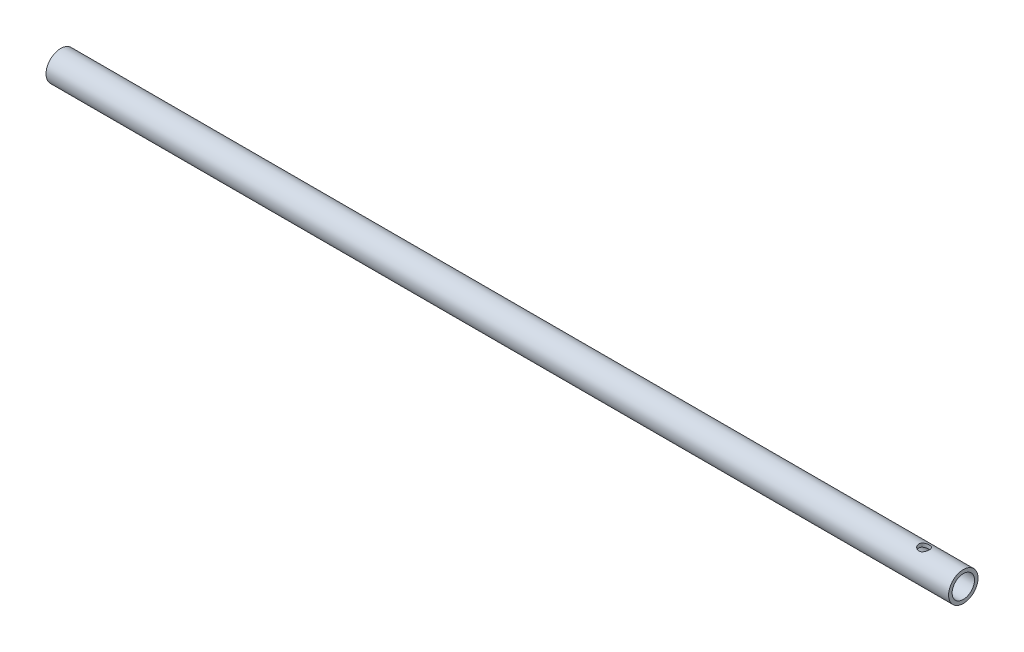
ISO-10303-21;
HEADER;
FILE_DESCRIPTION(('STEP AP214'),'2;1');
FILE_NAME('part.step','',(''),(''),'','','');
FILE_SCHEMA(('AUTOMOTIVE_DESIGN { 1 0 10303 214 1 1 1 1 }'));
ENDSEC;
DATA;
#1=APPLICATION_CONTEXT('core data for automotive mechanical design processes');
#2=APPLICATION_PROTOCOL_DEFINITION('international standard','automotive_design',2000,#1);
#3=PRODUCT_CONTEXT('',#1,'mechanical');
#4=PRODUCT('Part','Part','',(#3));
#5=PRODUCT_RELATED_PRODUCT_CATEGORY('part','',(#4));
#6=PRODUCT_DEFINITION_FORMATION('','',#4);
#7=PRODUCT_DEFINITION_CONTEXT('part definition',#1,'design');
#8=PRODUCT_DEFINITION('design','',#6,#7);
#9=PRODUCT_DEFINITION_SHAPE('','',#8);
#10=(LENGTH_UNIT() NAMED_UNIT(*) SI_UNIT(.MILLI.,.METRE.));
#11=(NAMED_UNIT(*) PLANE_ANGLE_UNIT() SI_UNIT($,.RADIAN.));
#12=(NAMED_UNIT(*) SI_UNIT($,.STERADIAN.) SOLID_ANGLE_UNIT());
#13=UNCERTAINTY_MEASURE_WITH_UNIT(LENGTH_MEASURE(1.E-05),#10,'distance_accuracy_value','');
#14=(GEOMETRIC_REPRESENTATION_CONTEXT(3) GLOBAL_UNCERTAINTY_ASSIGNED_CONTEXT((#13)) GLOBAL_UNIT_ASSIGNED_CONTEXT((#10,
#11,#12)) REPRESENTATION_CONTEXT('',''));
#15=CARTESIAN_POINT('',(0.,0.,0.));
#16=DIRECTION('',(0.,0.,1.));
#17=DIRECTION('',(1.,0.,0.));
#18=AXIS2_PLACEMENT_3D('',#15,#16,#17);
#19=CARTESIAN_POINT('',(0.,38.1,2032.));
#20=DIRECTION('',(0.,1.,0.));
#21=DIRECTION('',(0.,0.,1.));
#22=AXIS2_PLACEMENT_3D('',#19,#20,#21);
#23=CYLINDRICAL_SURFACE('',#22,3.3782);
#24=CARTESIAN_POINT('',(0.,-8.90580651934448,2028.6218));
#25=CARTESIAN_POINT('',(-0.0915206203541388,-8.90580687415743,2028.62180056569));
#26=CARTESIAN_POINT('',(-0.183043122337678,-8.90722275279153,2028.62552481863));
#27=CARTESIAN_POINT('',(-0.365410398842224,-8.91283224955234,2028.6403724418));
#28=CARTESIAN_POINT('',(-0.456254902432182,-8.9170269236798,2028.65149862492));
#29=CARTESIAN_POINT('',(-0.7269690249561,-8.93362066725651,2028.69589150111));
#30=CARTESIAN_POINT('',(-0.904923341874351,-8.95002926216944,2028.74017239345));
#31=CARTESIAN_POINT('',(-1.24982728710451,-8.9914453113372,2028.85623560384));
#32=CARTESIAN_POINT('',(-1.41680634047034,-9.01642855398771,2028.92794055109));
#33=CARTESIAN_POINT('',(-1.73640001041975,-9.07213881171126,2029.09659037364));
#34=CARTESIAN_POINT('',(-1.88901531039768,-9.10286555331392,2029.1935340473));
#35=CARTESIAN_POINT('',(-2.18236541050709,-9.16814057028092,2029.41454111232));
#36=CARTESIAN_POINT('',(-2.32236987087505,-9.20279315504331,2029.53954292769));
#37=CARTESIAN_POINT('',(-2.57994201764627,-9.27114039689816,2029.8111260333));
#38=CARTESIAN_POINT('',(-2.6975044755519,-9.30483482920966,2029.9577123382));
#39=CARTESIAN_POINT('',(-2.91024472717621,-9.36868652345153,2030.27371758884));
#40=CARTESIAN_POINT('',(-3.00464634523043,-9.39870756628294,2030.44368902768));
#41=CARTESIAN_POINT('',(-3.1632212659766,-9.45059348004089,2030.79834974884));
#42=CARTESIAN_POINT('',(-3.22740395037381,-9.47246088189008,2030.98303444248));
#43=CARTESIAN_POINT('',(-3.32120959838803,-9.50483860349147,2031.35423903006));
#44=CARTESIAN_POINT('',(-3.35208228499956,-9.51575843098211,2031.54040671183));
#45=CARTESIAN_POINT('',(-3.38238054486771,-9.52647223289394,2031.9155791645));
#46=CARTESIAN_POINT('',(-3.3818152794428,-9.52626944855033,2032.10458309283));
#47=CARTESIAN_POINT('',(-3.35001411582869,-9.51502996935777,2032.47116121979));
#48=CARTESIAN_POINT('',(-3.32013892684087,-9.50447392939019,2032.64887068279));
#49=CARTESIAN_POINT('',(-3.23283542772789,-9.47433087848601,2032.99656788178));
#50=CARTESIAN_POINT('',(-3.17540510229639,-9.45474320700498,2033.16655505198));
#51=CARTESIAN_POINT('',(-3.03390759166911,-9.40816014289965,2033.49678557571));
#52=CARTESIAN_POINT('',(-2.94947967772757,-9.38106513649884,2033.65685973749));
#53=CARTESIAN_POINT('',(-2.75669845642623,-9.32225082488363,2033.96093960376));
#54=CARTESIAN_POINT('',(-2.64833906236345,-9.29053034393033,2034.10494120632));
#55=CARTESIAN_POINT('',(-2.40406577776571,-9.22379709718782,2034.38084012778));
#56=CARTESIAN_POINT('',(-2.26700070143769,-9.18869892499172,2034.51169960101));
#57=CARTESIAN_POINT('',(-1.97260200788268,-9.1205279895685,2034.74897619883));
#58=CARTESIAN_POINT('',(-1.81525791627633,-9.08745628615564,2034.85538061244));
#59=CARTESIAN_POINT('',(-1.48083520985759,-9.02656550509255,2035.04247664914));
#60=CARTESIAN_POINT('',(-1.30344278177014,-8.99885612239196,2035.12265066455));
#61=CARTESIAN_POINT('',(-1.02855582444714,-8.96454083977648,2035.21928108565));
#62=CARTESIAN_POINT('',(-0.9355039395898,-8.95431349377785,2035.24754544209));
#63=CARTESIAN_POINT('',(-0.747076735131655,-8.93659583875025,2035.29599054773));
#64=CARTESIAN_POINT('',(-0.651702497300307,-8.92910428043567,2035.31617498699));
#65=CARTESIAN_POINT('',(-0.46384609018976,-8.91740766471935,2035.34749608823));
#66=CARTESIAN_POINT('',(-0.371434631959882,-8.9130664316492,2035.35900858763));
#67=CARTESIAN_POINT('',(-0.185883516350636,-8.90726360341033,2035.37436630476));
#68=CARTESIAN_POINT('',(-0.0927438566899769,-8.90580201726654,2035.37821149845));
#69=CARTESIAN_POINT('',(0.0919195633287035,-8.90581096074277,2035.37818865508));
#70=CARTESIAN_POINT('',(0.183443277058186,-8.90723097740055,2035.37445349743));
#71=CARTESIAN_POINT('',(0.365811939414904,-8.91284871699308,2035.35958390067));
#72=CARTESIAN_POINT('',(0.456656617127483,-8.91704749438991,2035.34844665266));
#73=CARTESIAN_POINT('',(0.727369374583149,-8.93365328239551,2035.30402053424));
#74=CARTESIAN_POINT('',(0.905320609788449,-8.95006954930708,2035.25971742784));
#75=CARTESIAN_POINT('',(1.25021472412577,-8.9914992832786,2035.14361047525));
#76=CARTESIAN_POINT('',(1.41718703500265,-9.01648854644952,2035.07188398812));
#77=CARTESIAN_POINT('',(1.73676398420038,-9.07220864499143,2034.90319207242));
#78=CARTESIAN_POINT('',(1.88936929905393,-9.10293920980459,2034.80622783309));
#79=CARTESIAN_POINT('',(2.18269668330051,-9.16821962469528,2034.58517950727));
#80=CARTESIAN_POINT('',(2.32268818598684,-9.20287369422962,2034.46015692));
#81=CARTESIAN_POINT('',(2.58023088482001,-9.27122099114283,2034.18853381479));
#82=CARTESIAN_POINT('',(2.69777685725995,-9.3049139933061,2034.04192828792));
#83=CARTESIAN_POINT('',(2.91047725722951,-9.36875899356517,2033.72589034489));
#84=CARTESIAN_POINT('',(3.00485609331308,-9.3987748054751,2033.55590599534));
#85=CARTESIAN_POINT('',(3.16338337472917,-9.45064792310465,2033.201223462));
#86=CARTESIAN_POINT('',(3.22754120703232,-9.47250776171856,2033.01652986793));
#87=CARTESIAN_POINT('',(3.32129585259917,-9.5048688530745,2032.64531613536));
#88=CARTESIAN_POINT('',(3.35214304577981,-9.51577986936375,2032.45914819732));
#89=CARTESIAN_POINT('',(3.3823912915841,-9.52647608392381,2032.08397999424));
#90=CARTESIAN_POINT('',(3.38180150062316,-9.52626452178515,2031.89498056994));
#91=CARTESIAN_POINT('',(3.34995407972146,-9.51500879982829,2031.52841273738));
#92=CARTESIAN_POINT('',(3.32005663063988,-9.50444509403896,2031.35070892042));
#93=CARTESIAN_POINT('',(3.23271027326889,-9.47428808657123,2031.0030265612));
#94=CARTESIAN_POINT('',(3.1752593464374,-9.4546941233487,2030.83304858593));
#95=CARTESIAN_POINT('',(3.03372071539422,-9.40809973286049,2030.50283541726));
#96=CARTESIAN_POINT('',(2.9492716670067,-9.38099954054635,2030.34276975871));
#97=CARTESIAN_POINT('',(2.75644941863552,-9.32217698537447,2030.03871012042));
#98=CARTESIAN_POINT('',(2.64807013295788,-9.29045344745351,2029.89472024295));
#99=CARTESIAN_POINT('',(2.40375733435914,-9.22371644143164,2029.61884820241));
#100=CARTESIAN_POINT('',(2.26667267614132,-9.18861769960238,2029.48800408219));
#101=CARTESIAN_POINT('',(1.97223673908679,-9.1204486913023,2029.25076146443));
#102=CARTESIAN_POINT('',(1.81487498040229,-9.08737948689992,2029.14437568744));
#103=CARTESIAN_POINT('',(1.48042363384821,-9.0264977494164,2028.95732310065));
#104=CARTESIAN_POINT('',(1.30302072678317,-8.99879481595814,2028.87717322962));
#105=CARTESIAN_POINT('',(1.02812157245388,-8.96449097859576,2028.78058021477));
#106=CARTESIAN_POINT('',(0.935066314856111,-8.95426774782618,2028.75232853722));
#107=CARTESIAN_POINT('',(0.746633565856914,-8.93655877043514,2028.70390905203));
#108=CARTESIAN_POINT('',(0.651257157136259,-8.92907177266856,2028.6837375493));
#109=CARTESIAN_POINT('',(0.463536581531303,-8.91739297008603,2028.6524649567));
#110=CARTESIAN_POINT('',(0.371265206685649,-8.91306084078929,2028.6409766089));
#111=CARTESIAN_POINT('',(0.185996537149762,-8.90726743034958,2028.62564383037));
#112=CARTESIAN_POINT('',(0.0929992400350158,-8.90580615879911,2028.62179942517));
#113=CARTESIAN_POINT('',(0.,-8.90580651934448,2028.6218));
#114=B_SPLINE_CURVE_WITH_KNOTS('',3,(#24,#25,#26,#27,#28,#29,#30,#31,#32,#33,#34,#35,#36,#37,
#38,#39,#40,#41,#42,#43,#44,#45,#46,#47,#48,#49,#50,#51,#52,#53,#54,#55,#56,#57,#58,#59,#60,#61,
#62,#63,#64,#65,#66,#67,#68,#69,#70,#71,#72,#73,#74,#75,#76,#77,#78,#79,#80,#81,#82,#83,#84,#85,
#86,#87,#88,#89,#90,#91,#92,#93,#94,#95,#96,#97,#98,#99,#100,#101,#102,#103,#104,#105,#106,#107,
#108,#109,#110,#111,#112,#113),.UNSPECIFIED.,.T.,.F.,(4,2,2,2,2,2,2,2,2,2,2,2,2,2,2,2,2,2,2,2,2,
2,2,2,2,2,2,2,2,2,2,2,2,2,2,2,2,2,2,2,2,2,2,2,4),(0.,0.274468364538614,0.549041092711528,
1.0984704637008,1.64636104334585,2.19422554242584,2.76425260796029,3.33441231573246,
3.92165414154812,4.50871353311567,5.07288722742166,5.63689651700481,6.17590383987418,
6.7149505902563,7.26152394699874,7.80823647895222,8.38376107616807,8.95958413978659,
9.54616675367551,9.83919663136975,10.132092530416,10.4114194123222,10.6907471696473,
10.9652207647424,11.2397985746675,11.7892370881635,12.3371369825379,12.8850110637365,
13.4550510885109,14.0252236163912,14.6124636215983,15.1995211032332,15.7636816699461,
16.3276779187254,16.8666810899068,17.4057237539911,17.9523063319348,18.499028071613,
19.0745633426128,19.6503972705725,20.2369758679105,20.5300031069142,20.8228961908011,
21.1017979719347,21.3807006849733),.UNSPECIFIED.);
#115=CARTESIAN_POINT('',(0.,-8.90580651934448,2028.6218));
#116=VERTEX_POINT('',#115);
#117=EDGE_CURVE('E46',#116,#116,#114,.T.);
#118=ORIENTED_EDGE('',*,*,#117,.F.);
#119=EDGE_LOOP('',(#118));
#120=FACE_BOUND('',#119,.T.);
#121=CARTESIAN_POINT('',(0.,-6.40241249530186,2028.6218));
#122=CARTESIAN_POINT('',(-0.0890179996863658,-6.40241148977448,2028.62179931325));
#123=CARTESIAN_POINT('',(-0.178022826666587,-6.40427611916514,2028.62532380031));
#124=CARTESIAN_POINT('',(-0.355333842737386,-6.41165195374766,2028.63936094135));
#125=CARTESIAN_POINT('',(-0.44363984347501,-6.41716411030146,2028.64987541849));
#126=CARTESIAN_POINT('',(-0.706637415629791,-6.43893158835621,2028.69177548396));
#127=CARTESIAN_POINT('',(-0.879371076444259,-6.46041780055707,2028.73351763899));
#128=CARTESIAN_POINT('',(-1.2137262290946,-6.51435002917386,2028.84247391846));
#129=CARTESIAN_POINT('',(-1.37539279241821,-6.54674796142641,2028.9095764443));
#130=CARTESIAN_POINT('',(-1.68521259182856,-6.61876943782388,2029.06699964205));
#131=CARTESIAN_POINT('',(-1.83336335597807,-6.65839429976084,2029.15732454966));
#132=CARTESIAN_POINT('',(-2.12354646252068,-6.74386605637626,2029.36618406807));
#133=CARTESIAN_POINT('',(-2.26439057117016,-6.78995511701508,2029.4862701926));
#134=CARTESIAN_POINT('',(-2.52484147302545,-6.8811928452854,2029.74799823764));
#135=CARTESIAN_POINT('',(-2.64443986726998,-6.92634113480838,2029.88964864215));
#136=CARTESIAN_POINT('',(-2.86564214482997,-7.01369162971585,2030.20035832676));
#137=CARTESIAN_POINT('',(-2.96583496438417,-7.05558003978932,2030.37051854996));
#138=CARTESIAN_POINT('',(-3.13564095599325,-7.12862072998245,2030.72759712823));
#139=CARTESIAN_POINT('',(-3.20527078825541,-7.15977885729212,2030.91450628621));
#140=CARTESIAN_POINT('',(-3.30743411105787,-7.20611334996814,2031.28722350597));
#141=CARTESIAN_POINT('',(-3.34203805441672,-7.22217704717831,2031.47235134226));
#142=CARTESIAN_POINT('',(-3.37993234138131,-7.2397878630478,2031.84643282999));
#143=CARTESIAN_POINT('',(-3.3832388245397,-7.24134246378853,2032.03538445918));
#144=CARTESIAN_POINT('',(-3.35936440273945,-7.23022400805472,2032.39640335801));
#145=CARTESIAN_POINT('',(-3.33448122866513,-7.21862317506157,2032.56866253819));
#146=CARTESIAN_POINT('',(-3.25897283937589,-7.18405642248002,2032.9062287846));
#147=CARTESIAN_POINT('',(-3.20834577871978,-7.16108968813427,2033.07153535151));
#148=CARTESIAN_POINT('',(-3.08230993550248,-7.10551088746438,2033.39354044798));
#149=CARTESIAN_POINT('',(-3.00654250415638,-7.07275995779467,2033.55007364526));
#150=CARTESIAN_POINT('',(-2.83280098790854,-7.00067158770838,2033.84860382737));
#151=CARTESIAN_POINT('',(-2.7348192653187,-6.96133188316627,2033.99059578822));
#152=CARTESIAN_POINT('',(-2.5098062031957,-6.87592107228675,2034.2688707602));
#153=CARTESIAN_POINT('',(-2.38101423927152,-6.82956202865565,2034.40364424353));
#154=CARTESIAN_POINT('',(-2.10285082118896,-6.73762592159223,2034.65045262685));
#155=CARTESIAN_POINT('',(-1.95346281182404,-6.69204952073139,2034.76246905361));
#156=CARTESIAN_POINT('',(-1.6289073843438,-6.6044490757177,2034.96602488187));
#157=CARTESIAN_POINT('',(-1.45282140027363,-6.56271889645303,2035.05625138864));
#158=CARTESIAN_POINT('',(-1.17770068044086,-6.50920402700182,2035.16781820475));
#159=CARTESIAN_POINT('',(-1.08420504225008,-6.4928842847101,2035.20103566176));
#160=CARTESIAN_POINT('',(-0.894151097996211,-6.46386824227027,2035.25923120241));
#161=CARTESIAN_POINT('',(-0.797594173330214,-6.45117033292739,2035.28421294597));
#162=CARTESIAN_POINT('',(-0.585239211869538,-6.42809559885846,2035.3291834789));
#163=CARTESIAN_POINT('',(-0.469008571097502,-6.41850331615469,2035.34755479999));
#164=CARTESIAN_POINT('',(-0.234912027715166,-6.40565541834833,2035.37207590054));
#165=CARTESIAN_POINT('',(-0.117046259859072,-6.40239928415844,2035.37822668115));
#166=CARTESIAN_POINT('',(0.0898184343522924,-6.4024225623206,2035.37817967946));
#167=CARTESIAN_POINT('',(0.178828191060674,-6.40429850269924,2035.37463377207));
#168=CARTESIAN_POINT('',(0.35614683167679,-6.41169702274945,2035.36055313633));
#169=CARTESIAN_POINT('',(0.444455527554662,-6.41722054937558,2035.35001659314));
#170=CARTESIAN_POINT('',(0.707457247499605,-6.43902158156982,2035.30804981486));
#171=CARTESIAN_POINT('',(0.88018903173179,-6.46052941882042,2035.26626250609));
#172=CARTESIAN_POINT('',(1.21453262655581,-6.51450055149511,2035.15721645588));
#173=CARTESIAN_POINT('',(1.37618954441662,-6.54691577917453,2035.09006931638));
#174=CARTESIAN_POINT('',(1.68598357300176,-6.61896616138833,2034.93255774833));
#175=CARTESIAN_POINT('',(1.83411820100346,-6.65860263777402,2034.84218906784));
#176=CARTESIAN_POINT('',(2.12426516423679,-6.74409284386059,2034.63323734758));
#177=CARTESIAN_POINT('',(2.26508836587838,-6.79018835468618,2034.51310228716));
#178=CARTESIAN_POINT('',(2.52548888154606,-6.88143091288963,2034.2512770643));
#179=CARTESIAN_POINT('',(2.64505780495999,-6.92657757951534,2034.10957842992));
#180=CARTESIAN_POINT('',(2.86617869974458,-7.01391156699681,2033.79878709844));
#181=CARTESIAN_POINT('',(2.96632162174662,-7.05578516134445,2033.62859559797));
#182=CARTESIAN_POINT('',(3.13602223871757,-7.12878898318622,2033.27146309677));
#183=CARTESIAN_POINT('',(3.20559662050195,-7.15992507009044,2033.08453130153));
#184=CARTESIAN_POINT('',(3.3076446786845,-7.20621031910312,2032.71179522409));
#185=CARTESIAN_POINT('',(3.34219136773074,-7.22224810591477,2032.52667122944));
#186=CARTESIAN_POINT('',(3.37997491512424,-7.23980785431812,2032.15260888324));
#187=CARTESIAN_POINT('',(3.38322789070649,-7.24133728815683,2031.96367254541));
#188=CARTESIAN_POINT('',(3.35925619256842,-7.23017367237102,2031.60268348654));
#189=CARTESIAN_POINT('',(3.334327348999,-7.21855191266277,2031.4304382436));
#190=CARTESIAN_POINT('',(3.25873204223378,-7.18394700864941,2031.0929071505));
#191=CARTESIAN_POINT('',(3.20806372675145,-7.16096304669069,2030.92762180212));
#192=CARTESIAN_POINT('',(3.08194459384531,-7.10535208141189,2030.6056509294));
#193=CARTESIAN_POINT('',(3.00613310530983,-7.07258547532763,2030.4491317863));
#194=CARTESIAN_POINT('',(2.83230528522054,-7.00047054984572,2030.15063614203));
#195=CARTESIAN_POINT('',(2.7342813120035,-6.9611199666132,2030.00866467009));
#196=CARTESIAN_POINT('',(2.50917981787695,-6.87569171726644,2029.73043553201));
#197=CARTESIAN_POINT('',(2.38034136898433,-6.82932655832314,2029.59568831908));
#198=CARTESIAN_POINT('',(2.10208666264616,-6.73738653128031,2029.34894028042));
#199=CARTESIAN_POINT('',(1.9526538401312,-6.6918123329538,2029.23695794691));
#200=CARTESIAN_POINT('',(1.62802269701308,-6.60423006026863,2029.03348934294));
#201=CARTESIAN_POINT('',(1.45190751696511,-6.56251586028696,2028.94331419878));
#202=CARTESIAN_POINT('',(1.17675016351826,-6.50903191378234,2028.83182855081));
#203=CARTESIAN_POINT('',(1.08324378315734,-6.49272366404267,2028.79863888295));
#204=CARTESIAN_POINT('',(0.893170983666327,-6.46373257823829,2028.74050005652));
#205=CARTESIAN_POINT('',(0.796605949316202,-6.45104812687172,2028.71554722562));
#206=CARTESIAN_POINT('',(0.584530032186226,-6.42803603719889,2028.67070243065));
#207=CARTESIAN_POINT('',(0.468595243717753,-6.41847858934153,2028.65239794481));
#208=CARTESIAN_POINT('',(0.23509922753544,-6.40566773496515,2028.62794767032));
#209=CARTESIAN_POINT('',(0.117538130991346,-6.40241382298624,2028.62180090678));
#210=CARTESIAN_POINT('',(0.,-6.40241249530186,2028.6218));
#211=B_SPLINE_CURVE_WITH_KNOTS('',3,(#121,#122,#123,#124,#125,#126,#127,#128,#129,#130,#131,
#132,#133,#134,#135,#136,#137,#138,#139,#140,#141,#142,#143,#144,#145,#146,#147,#148,#149,#150,
#151,#152,#153,#154,#155,#156,#157,#158,#159,#160,#161,#162,#163,#164,#165,#166,#167,#168,#169,
#170,#171,#172,#173,#174,#175,#176,#177,#178,#179,#180,#181,#182,#183,#184,#185,#186,#187,#188,
#189,#190,#191,#192,#193,#194,#195,#196,#197,#198,#199,#200,#201,#202,#203,#204,#205,#206,#207,
#208,#209,#210),.UNSPECIFIED.,.T.,.F.,(4,2,2,2,2,2,2,2,2,2,2,2,2,2,2,2,2,2,2,2,2,2,2,2,2,2,2,2,
2,2,2,2,2,2,2,2,2,2,2,2,2,2,2,2,4),(0.,0.266932768175014,0.533935186229559,1.068050891522,
1.59984307647391,2.13173232801676,2.70152258702446,3.27153759948346,3.87398580121175,
4.47610519298123,5.04008373748902,5.60377143227411,6.12462285454213,6.64551161912051,
7.174175970253,7.70302236244986,8.27679190105553,8.8510253570181,9.45413350706542,
9.75542454734251,10.0565815135449,10.4099712240964,10.7633319820692,11.0302829273226,
11.2973032033143,11.8314528248115,12.3632786787977,12.8952019816245,13.4650425047103,
14.0351074881723,14.6375508719024,15.2396649828074,15.8035947036547,16.3672339676106,
16.8880682665696,17.4089400515752,17.9376323911749,18.4665068913509,19.0403186378956,
19.6145946529238,20.217699757766,20.5189876206413,20.8201409746818,21.1726235616734,
21.5250778830711),.UNSPECIFIED.);
#212=CARTESIAN_POINT('',(0.,-6.40241249530186,2028.6218));
#213=VERTEX_POINT('',#212);
#214=EDGE_CURVE('E19',#213,#213,#211,.T.);
#215=ORIENTED_EDGE('',*,*,#214,.T.);
#216=EDGE_LOOP('',(#215));
#217=FACE_BOUND('',#216,.T.);
#218=ADVANCED_FACE('F15',(#120,#217),#23,.F.);
#219=CARTESIAN_POINT('',(-558.8,0.,2032.));
#220=DIRECTION('',(-1.,0.,0.));
#221=DIRECTION('',(0.,0.,1.));
#222=AXIS2_PLACEMENT_3D('',#219,#220,#221);
#223=CYLINDRICAL_SURFACE('',#222,7.239);
#224=CARTESIAN_POINT('',(-558.8,0.,2032.));
#225=DIRECTION('',(-1.,0.,0.));
#226=DIRECTION('',(0.,0.,1.));
#227=AXIS2_PLACEMENT_3D('',#224,#225,#226);
#228=CIRCLE('',#227,7.239);
#229=CARTESIAN_POINT('',(-558.8,0.,2039.239));
#230=VERTEX_POINT('',#229);
#231=EDGE_CURVE('E52',#230,#230,#228,.T.);
#232=ORIENTED_EDGE('',*,*,#231,.T.);
#233=EDGE_LOOP('',(#232));
#234=FACE_BOUND('',#233,.T.);
#235=CARTESIAN_POINT('',(-0.000794278650237034,6.40241254452159,2035.37819990654));
#236=CARTESIAN_POINT('',(0.0882179717645833,6.4024004941783,2035.37822152358));
#237=CARTESIAN_POINT('',(0.177218093230331,6.40425384308663,2035.37471841626));
#238=CARTESIAN_POINT('',(0.354521888492523,6.4116070504098,2035.36072466923));
#239=CARTESIAN_POINT('',(0.442825374717672,6.41710785914025,2035.3502322085));
#240=CARTESIAN_POINT('',(0.705818498348174,6.43884180510923,2035.30839879259));
#241=CARTESIAN_POINT('',(0.878553538182538,6.46030635001244,2035.26670186183));
#242=CARTESIAN_POINT('',(1.21291968727234,6.51419958113652,2035.1578355182));
#243=CARTESIAN_POINT('',(1.37459581004362,6.54658019041103,2035.09077764582));
#244=CARTESIAN_POINT('',(1.6844413852354,6.61857273820278,2034.93344283484));
#245=CARTESIAN_POINT('',(1.83260836195538,6.65818599820547,2034.84316165185));
#246=CARTESIAN_POINT('',(2.12282767228702,6.74363931029104,2034.63439426511));
#247=CARTESIAN_POINT('',(2.26369267989832,6.78972191096427,2034.5143570654));
#248=CARTESIAN_POINT('',(2.52419392253978,6.88095477864228,2034.25272619907));
#249=CARTESIAN_POINT('',(2.64382175408841,6.92610467036055,2034.11112404026));
#250=CARTESIAN_POINT('',(2.86510535786293,7.01347163177626,2033.8004960497));
#251=CARTESIAN_POINT('',(2.96534805323647,7.05537483896636,2033.63036713449));
#252=CARTESIAN_POINT('',(3.13525938471235,7.12845236606247,2033.27334254658));
#253=CARTESIAN_POINT('',(3.20494465408477,7.15963252082969,2033.0864560624));
#254=CARTESIAN_POINT('',(3.30722323903645,7.20601624555761,2032.71375776251));
#255=CARTESIAN_POINT('',(3.34188444462204,7.22210585344901,2032.52862610739));
#256=CARTESIAN_POINT('',(3.37988949248251,7.23976774315786,2032.15452551892));
#257=CARTESIAN_POINT('',(3.38324949630094,7.24134751673666,2031.96555861632));
#258=CARTESIAN_POINT('',(3.35947237320954,7.23027423340035,2031.60450989468));
#259=CARTESIAN_POINT('',(3.33463487604032,7.21869433254476,2031.43223677798));
#260=CARTESIAN_POINT('',(3.25921341666704,7.18416574277748,2031.09463537483));
#261=CARTESIAN_POINT('',(3.20862761553832,7.16121624186056,2030.92930758534));
#262=CARTESIAN_POINT('',(3.0826750572694,7.1056696130568,2030.60726825029));
#263=CARTESIAN_POINT('',(3.00695167294413,7.07293436148713,2030.45072098971));
#264=CARTESIAN_POINT('',(2.83329644999263,7.00087255722215,2030.15215628013));
#265=CARTESIAN_POINT('',(2.73535698139902,6.96154374122427,2030.0101438474));
#266=CARTESIAN_POINT('',(2.51043241651317,6.87615041460466,2029.73182315065));
#267=CARTESIAN_POINT('',(2.38168701143061,6.82979752471121,2029.59702347906));
#268=CARTESIAN_POINT('',(2.10361491300321,6.73786536726261,2029.3501547645));
#269=CARTESIAN_POINT('',(1.95427165322634,6.69228675592297,2029.23810419932));
#270=CARTESIAN_POINT('',(1.6297914478615,6.6046680404816,2029.03446086401));
#271=CARTESIAN_POINT('',(1.45373418775586,6.5629218032519,2028.94418281364));
#272=CARTESIAN_POINT('',(1.17864983048385,6.50937602693638,2028.83253485897));
#273=CARTESIAN_POINT('',(1.08516514509177,6.49304484691372,2028.79928972194));
#274=CARTESIAN_POINT('',(0.89513051526602,6.46400396561379,2028.7410376802));
#275=CARTESIAN_POINT('',(0.798581952783658,6.4512926567013,2028.71602711761));
#276=CARTESIAN_POINT('',(0.586205888857571,6.42818322541205,2028.67098533187));
#277=CARTESIAN_POINT('',(0.469944218032725,6.41857115567819,2028.65257511462));
#278=CARTESIAN_POINT('',(0.23578046839574,6.40568673206415,2028.62798341842));
#279=CARTESIAN_POINT('',(0.117878525158692,6.40241385732289,2028.62180093478));
#280=CARTESIAN_POINT('',(-0.089018409299,6.40241146674383,2028.62179929408));
#281=CARTESIAN_POINT('',(-0.178023463670694,6.40427612561407,2028.62532381914));
#282=CARTESIAN_POINT('',(-0.355334890163063,6.41165201740328,2028.6393610559));
#283=CARTESIAN_POINT('',(-0.443641075033442,6.41716419623122,2028.64987558032));
#284=CARTESIAN_POINT('',(-0.706638357361064,6.43893169802707,2028.69177570248));
#285=CARTESIAN_POINT('',(-0.87937152814075,6.46041787120202,2028.73351778326));
#286=CARTESIAN_POINT('',(-1.21372613313268,6.51435001590007,2028.8424738901));
#287=CARTESIAN_POINT('',(-1.3753926166706,6.54674792682266,2028.90957637223));
#288=CARTESIAN_POINT('',(-1.68521243387262,6.61876939484066,2029.06699954455));
#289=CARTESIAN_POINT('',(-1.83336328105662,6.6583942774812,2029.15732449537));
#290=CARTESIAN_POINT('',(-2.12354647559162,6.7438660604533,2029.36618407787));
#291=CARTESIAN_POINT('',(-2.26439059627385,6.78995512529193,2029.48627021413));
#292=CARTESIAN_POINT('',(-2.52484149451091,6.88119285333061,2029.74799826293));
#293=CARTESIAN_POINT('',(-2.64443987690182,6.92634113859297,2029.88964865562));
#294=CARTESIAN_POINT('',(-2.86564214423003,7.01369162949894,2030.20035832598));
#295=CARTESIAN_POINT('',(-2.9658349633958,7.05558003938238,2030.37051854829));
#296=CARTESIAN_POINT('',(-3.1356409553261,7.12862072967744,2030.72759712642));
#297=CARTESIAN_POINT('',(-3.20527078800169,7.15977885717509,2030.91450628528));
#298=CARTESIAN_POINT('',(-3.30743411080239,7.20611334985411,2031.28722350505));
#299=CARTESIAN_POINT('',(-3.34203805406121,7.22217704701467,2031.47235134036));
#300=CARTESIAN_POINT('',(-3.37993234134646,7.23978786302999,2031.84643282805));
#301=CARTESIAN_POINT('',(-3.38323882460474,7.24134246381741,2032.03538445821));
#302=CARTESIAN_POINT('',(-3.35936440281351,7.23022400809051,2032.39640335687));
#303=CARTESIAN_POINT('',(-3.3344812289864,7.21862317521514,2032.56866253593));
#304=CARTESIAN_POINT('',(-3.25897284005081,7.18405642278247,2032.90622878241));
#305=CARTESIAN_POINT('',(-3.20834577916274,7.16108968831841,2033.07153535044));
#306=CARTESIAN_POINT('',(-3.08230993010411,7.10551088509518,2033.39354046171));
#307=CARTESIAN_POINT('',(-3.00654249122736,7.07275995224702,2033.55007367178));
#308=CARTESIAN_POINT('',(-2.83280097137733,7.00067158103286,2033.84860385146));
#309=CARTESIAN_POINT('',(-2.7348192564661,6.96133187965304,2033.99059579957));
#310=CARTESIAN_POINT('',(-2.50980626333832,6.87592109528173,2034.26887068539));
#311=CARTESIAN_POINT('',(-2.3810143710399,6.82956207671068,2034.40364410421));
#312=CARTESIAN_POINT('',(-2.10285097740175,6.73762596871004,2034.6504525107));
#313=CARTESIAN_POINT('',(-1.95346289972297,6.69204954269555,2034.76246900154));
#314=CARTESIAN_POINT('',(-1.62890694319767,6.60444895849747,2034.96602515534));
#315=CARTESIAN_POINT('',(-1.45282045513505,6.56271867872492,2035.05625186338));
#316=CARTESIAN_POINT('',(-1.17769941033772,6.50920379695833,2035.16781867398));
#317=CARTESIAN_POINT('',(-1.08420396395514,6.49288410081417,2035.2010360287));
#318=CARTESIAN_POINT('',(-0.894150439354311,6.46386816095048,2035.25923136739));
#319=CARTESIAN_POINT('',(-0.797593746476036,6.45117030349005,2035.28421302163));
#320=CARTESIAN_POINT('',(-0.585496680653819,6.42812355587282,2035.32912897184));
#321=CARTESIAN_POINT('',(-0.469530851657106,6.4185463675843,2035.34747225964));
#322=CARTESIAN_POINT('',(-0.235967632596039,6.40569907414169,2035.37199296087));
#323=CARTESIAN_POINT('',(-0.118370374502029,6.4024284617949,2035.37817135265));
#324=CARTESIAN_POINT('',(-0.000794278650237034,6.40241254452159,2035.37819990654));
#325=B_SPLINE_CURVE_WITH_KNOTS('',3,(#235,#236,#237,#238,#239,#240,#241,#242,#243,#244,#245,
#246,#247,#248,#249,#250,#251,#252,#253,#254,#255,#256,#257,#258,#259,#260,#261,#262,#263,#264,
#265,#266,#267,#268,#269,#270,#271,#272,#273,#274,#275,#276,#277,#278,#279,#280,#281,#282,#283,
#284,#285,#286,#287,#288,#289,#290,#291,#292,#293,#294,#295,#296,#297,#298,#299,#300,#301,#302,
#303,#304,#305,#306,#307,#308,#309,#310,#311,#312,#313,#314,#315,#316,#317,#318,#319,#320,#321,
#322,#323,#324),.UNSPECIFIED.,.T.,.F.,(4,2,2,2,2,2,2,2,2,2,2,2,2,2,2,2,2,2,2,2,2,2,2,2,2,2,2,2,
2,2,2,2,2,2,2,2,2,2,2,2,2,2,2,2,4),(0.,0.266915512522962,0.533900595023376,1.06798098425101,
1.5997392364677,2.13159474421378,2.70133477442074,3.27129974882833,3.87375270236711,
4.47587731543977,5.03990468014893,5.60364080816923,6.12450939317859,6.64541518345449,
7.17405162035875,7.70286988958471,8.27659691441179,8.85078809654656,9.45390080020369,
9.75519438379614,10.056353949283,10.4098576166441,10.7633322370819,11.030265916448,
11.2972688466942,11.8313831325246,12.3631750319895,12.8950645690808,13.4648548789007,
14.0348698405492,14.6373180393536,15.2394374340461,15.8034159756632,16.3671036733388,
16.8879550921834,17.4088438601857,17.9375082560038,18.4663546035074,19.0401238459753,
19.6143575980654,20.2174673245197,20.5187577637214,20.8199137499648,21.1725102515376,
21.5250783951188),.UNSPECIFIED.);
#326=CARTESIAN_POINT('',(-0.000794278650237034,6.40241254452159,2035.37819990654));
#327=VERTEX_POINT('',#326);
#328=EDGE_CURVE('E76',#327,#327,#325,.T.);
#329=ORIENTED_EDGE('',*,*,#328,.T.);
#330=EDGE_LOOP('',(#329));
#331=FACE_BOUND('',#330,.T.);
#332=CARTESIAN_POINT('',(25.4,0.,2032.));
#333=DIRECTION('',(-1.,0.,0.));
#334=DIRECTION('',(0.,0.,1.));
#335=AXIS2_PLACEMENT_3D('',#332,#333,#334);
#336=CIRCLE('',#335,7.239);
#337=CARTESIAN_POINT('',(25.4,0.,2039.239));
#338=VERTEX_POINT('',#337);
#339=EDGE_CURVE('E51',#338,#338,#336,.T.);
#340=ORIENTED_EDGE('',*,*,#339,.F.);
#341=EDGE_LOOP('',(#340));
#342=FACE_BOUND('',#341,.T.);
#343=ORIENTED_EDGE('',*,*,#214,.F.);
#344=EDGE_LOOP('',(#343));
#345=FACE_BOUND('',#344,.T.);
#346=ADVANCED_FACE('F61',(#234,#331,#342,#345),#223,.F.);
#347=CARTESIAN_POINT('',(-558.8,0.,1905.));
#348=DIRECTION('',(1.,0.,0.));
#349=DIRECTION('',(0.,0.,-1.));
#350=AXIS2_PLACEMENT_3D('',#347,#348,#349);
#351=PLANE('',#350);
#352=ORIENTED_EDGE('',*,*,#231,.F.);
#353=EDGE_LOOP('',(#352));
#354=FACE_BOUND('',#353,.T.);
#355=CARTESIAN_POINT('',(-558.8,0.,2032.));
#356=DIRECTION('',(-1.,0.,0.));
#357=DIRECTION('',(0.,0.,1.));
#358=AXIS2_PLACEMENT_3D('',#355,#356,#357);
#359=CIRCLE('',#358,9.525);
#360=CARTESIAN_POINT('',(-558.8,0.,2041.525));
#361=VERTEX_POINT('',#360);
#362=EDGE_CURVE('E30',#361,#361,#359,.F.);
#363=ORIENTED_EDGE('',*,*,#362,.F.);
#364=EDGE_LOOP('',(#363));
#365=FACE_BOUND('',#364,.T.);
#366=ADVANCED_FACE('F63',(#354,#365),#351,.F.);
#367=CARTESIAN_POINT('',(25.4,0.,1905.));
#368=DIRECTION('',(1.,0.,0.));
#369=DIRECTION('',(0.,0.,-1.));
#370=AXIS2_PLACEMENT_3D('',#367,#368,#369);
#371=PLANE('',#370);
#372=ORIENTED_EDGE('',*,*,#339,.T.);
#373=EDGE_LOOP('',(#372));
#374=FACE_BOUND('',#373,.T.);
#375=CARTESIAN_POINT('',(25.4,0.,2032.));
#376=DIRECTION('',(-1.,0.,0.));
#377=DIRECTION('',(0.,0.,1.));
#378=AXIS2_PLACEMENT_3D('',#375,#376,#377);
#379=CIRCLE('',#378,9.525);
#380=CARTESIAN_POINT('',(25.4,0.,2041.525));
#381=VERTEX_POINT('',#380);
#382=EDGE_CURVE('E25',#381,#381,#379,.T.);
#383=ORIENTED_EDGE('',*,*,#382,.F.);
#384=EDGE_LOOP('',(#383));
#385=FACE_BOUND('',#384,.T.);
#386=ADVANCED_FACE('F69',(#374,#385),#371,.T.);
#387=CARTESIAN_POINT('',(0.,38.1,2032.));
#388=DIRECTION('',(0.,1.,0.));
#389=DIRECTION('',(0.,0.,1.));
#390=AXIS2_PLACEMENT_3D('',#387,#388,#389);
#391=CYLINDRICAL_SURFACE('',#390,3.3782);
#392=CARTESIAN_POINT('',(-0.000397152050164892,8.90580655215261,2035.37820001136));
#393=CARTESIAN_POINT('',(-0.0919195581060422,8.90581098451375,2035.3781886897));
#394=CARTESIAN_POINT('',(-0.183443270893331,8.907230983802,2035.37445350721));
#395=CARTESIAN_POINT('',(-0.365811932827918,8.912848710196,2035.35958389193));
#396=CARTESIAN_POINT('',(-0.45665661105382,8.91704749179908,2035.3484466502));
#397=CARTESIAN_POINT('',(-0.727369371015398,8.93365328661634,2035.30402054175));
#398=CARTESIAN_POINT('',(-0.905320608037652,8.95006955031346,2035.25971743021));
#399=CARTESIAN_POINT('',(-1.25021472467993,8.99149928213188,2035.14361047329));
#400=CARTESIAN_POINT('',(-1.41718703611848,9.01648854629149,2035.07188398716));
#401=CARTESIAN_POINT('',(-1.73676398523819,9.07220864552493,2034.90319207224));
#402=CARTESIAN_POINT('',(-1.88936929954756,9.10293921000279,2034.80622783285));
#403=CARTESIAN_POINT('',(-2.18269668306592,9.16821962455115,2034.58517950731));
#404=CARTESIAN_POINT('',(-2.32268818554099,9.20287369409462,2034.46015692036));
#405=CARTESIAN_POINT('',(-2.58023088444754,9.27122099106064,2034.18853381529));
#406=CARTESIAN_POINT('',(-2.69777685709905,9.30491399326443,2034.04192828817));
#407=CARTESIAN_POINT('',(-2.9104772573056,9.3687589935812,2033.72589034477));
#408=CARTESIAN_POINT('',(-3.00485609343913,9.39877480551332,2033.55590599511));
#409=CARTESIAN_POINT('',(-3.16338337481577,9.45064792313603,2033.20122346175));
#410=CARTESIAN_POINT('',(-3.2275412070673,9.47250776173111,2033.01652986779));
#411=CARTESIAN_POINT('',(-3.32129585259284,9.50486885307186,2032.64531613538));
#412=CARTESIAN_POINT('',(-3.35214304576947,9.51577986935999,2032.45914819738));
#413=CARTESIAN_POINT('',(-3.38239129158471,9.52647608392414,2032.0839799943));
#414=CARTESIAN_POINT('',(-3.38180150062598,9.52626452178618,2031.89498056996));
#415=CARTESIAN_POINT('',(-3.34995407971839,9.51500879982718,2031.52841273735));
#416=CARTESIAN_POINT('',(-3.32005663063343,9.50444509403668,2031.35070892038));
#417=CARTESIAN_POINT('',(-3.23271027325778,9.47428808656745,2031.00302656117));
#418=CARTESIAN_POINT('',(-3.17525934642817,9.45469412334563,2030.8330485859));
#419=CARTESIAN_POINT('',(-3.03372071538863,9.40809973285868,2030.50283541725));
#420=CARTESIAN_POINT('',(-2.94927166700176,9.3809995405448,2030.3427697587));
#421=CARTESIAN_POINT('',(-2.75644941862985,9.32217698537277,2030.03871012041));
#422=CARTESIAN_POINT('',(-2.64807013295008,9.29045344745126,2029.89472024294));
#423=CARTESIAN_POINT('',(-2.40375733434784,9.22371644142868,2029.6188482024));
#424=CARTESIAN_POINT('',(-2.2666726761289,9.1886176995993,2029.48800408218));
#425=CARTESIAN_POINT('',(-1.9722367390729,9.12044869129928,2029.25076146442));
#426=CARTESIAN_POINT('',(-1.81487498038819,9.0873794868971,2029.14437568743));
#427=CARTESIAN_POINT('',(-1.48042363383357,9.02649774941399,2028.95732310064));
#428=CARTESIAN_POINT('',(-1.30302072676819,8.99879481595597,2028.87717322962));
#429=CARTESIAN_POINT('',(-1.02812157243843,8.96449097859399,2028.78058021476));
#430=CARTESIAN_POINT('',(-0.935066314840478,8.95426774782455,2028.75232853722));
#431=CARTESIAN_POINT('',(-0.746633565841032,8.93655877043381,2028.70390905202));
#432=CARTESIAN_POINT('',(-0.651257157120312,8.9290717726674,2028.6837375493));
#433=CARTESIAN_POINT('',(-0.463536581517871,8.91739297008535,2028.6524649567));
#434=CARTESIAN_POINT('',(-0.371265206674837,8.91306084078885,2028.6409766089));
#435=CARTESIAN_POINT('',(-0.185996537144296,8.90726743034952,2028.62564383037));
#436=CARTESIAN_POINT('',(-0.092999240032276,8.90580615879919,2028.62179942517));
#437=CARTESIAN_POINT('',(0.091520620354126,8.90580687415751,2028.62180056569));
#438=CARTESIAN_POINT('',(0.183043122337639,8.90722275279156,2028.62552481863));
#439=CARTESIAN_POINT('',(0.365410398842129,8.91283224955232,2028.6403724418));
#440=CARTESIAN_POINT('',(0.456254902432057,8.91702692367979,2028.65149862492));
#441=CARTESIAN_POINT('',(0.72696902495599,8.93362066725652,2028.69589150111));
#442=CARTESIAN_POINT('',(0.904923341874276,8.95002926216943,2028.74017239345));
#443=CARTESIAN_POINT('',(1.24982728710468,8.99144531133722,2028.85623560384));
#444=CARTESIAN_POINT('',(1.41680634047071,9.01642855398777,2028.92794055109));
#445=CARTESIAN_POINT('',(1.73640001042008,9.07213881171132,2029.09659037364));
#446=CARTESIAN_POINT('',(1.88901531039779,9.10286555331394,2029.1935340473));
#447=CARTESIAN_POINT('',(2.18236541050616,9.16814057028071,2029.41454111231));
#448=CARTESIAN_POINT('',(2.32236987087341,9.20279315504291,2029.53954292769));
#449=CARTESIAN_POINT('',(2.57994201764492,9.27114039689777,2029.8111260333));
#450=CARTESIAN_POINT('',(2.69750447555126,9.30483482920946,2029.9577123382));
#451=CARTESIAN_POINT('',(2.9102447271788,9.36868652345231,2030.27371758884));
#452=CARTESIAN_POINT('',(3.00464634523504,9.3987075662844,2030.44368902768));
#453=CARTESIAN_POINT('',(3.16322126597978,9.45059348004197,2030.79834974885));
#454=CARTESIAN_POINT('',(3.22740395037499,9.47246088189048,2030.98303444248));
#455=CARTESIAN_POINT('',(3.32120959838397,9.50483860349008,2031.35423903005));
#456=CARTESIAN_POINT('',(3.35208228499412,9.5157584309802,2031.5404067118));
#457=CARTESIAN_POINT('',(3.3823805448678,9.52647223289395,2031.91557916446));
#458=CARTESIAN_POINT('',(3.38181527944426,9.52626944855081,2032.10458309282));
#459=CARTESIAN_POINT('',(3.35001411582428,9.51502996935623,2032.47116121984));
#460=CARTESIAN_POINT('',(3.32013892682387,9.50447392938429,2032.6488706829));
#461=CARTESIAN_POINT('',(3.2328354276953,9.4743308784748,2032.99656788188));
#462=CARTESIAN_POINT('',(3.17540510227638,9.45474320699796,2033.16655505203));
#463=CARTESIAN_POINT('',(3.03390759172759,9.40816014291935,2033.49678557557));
#464=CARTESIAN_POINT('',(2.94947967786634,9.38106513654506,2033.65685973723));
#465=CARTESIAN_POINT('',(2.75669845660428,9.32225082493408,2033.96093960352));
#466=CARTESIAN_POINT('',(2.64833906246133,9.29053034395093,2034.1049412062));
#467=CARTESIAN_POINT('',(2.40406577750773,9.22379709712381,2034.38084012808));
#468=CARTESIAN_POINT('',(2.26700070087292,9.18869892487177,2034.51169960159));
#469=CARTESIAN_POINT('',(1.97260200723308,9.12052798940727,2034.74897619923));
#470=CARTESIAN_POINT('',(1.81525791593174,9.08745628600061,2034.8553806125));
#471=CARTESIAN_POINT('',(1.48083521044733,9.02656550529394,2035.04247664894));
#472=CARTESIAN_POINT('',(1.30344278301511,8.99885612294065,2035.12265066451));
#473=CARTESIAN_POINT('',(1.02855582592248,8.96454083976407,2035.21928108493));
#474=CARTESIAN_POINT('',(0.93550394060498,8.95431349337052,2035.24754544107));
#475=CARTESIAN_POINT('',(0.747076735525109,8.93659583928982,2035.29599054839));
#476=CARTESIAN_POINT('',(0.65170249753923,8.92910428230815,2035.31617498965));
#477=CARTESIAN_POINT('',(0.463846090423043,8.91740766296233,2035.34749608562));
#478=CARTESIAN_POINT('',(0.371434632356843,8.9130664252061,2035.3590085782));
#479=CARTESIAN_POINT('',(0.185883518148634,8.90726360992209,2035.37436631401));
#480=CARTESIAN_POINT('',(0.092743859729296,8.90580204140362,2035.37821153324));
#481=CARTESIAN_POINT('',(-0.000397152050164892,8.90580655215261,2035.37820001136));
#482=B_SPLINE_CURVE_WITH_KNOTS('',3,(#392,#393,#394,#395,#396,#397,#398,#399,#400,#401,#402,
#403,#404,#405,#406,#407,#408,#409,#410,#411,#412,#413,#414,#415,#416,#417,#418,#419,#420,#421,
#422,#423,#424,#425,#426,#427,#428,#429,#430,#431,#432,#433,#434,#435,#436,#437,#438,#439,#440,
#441,#442,#443,#444,#445,#446,#447,#448,#449,#450,#451,#452,#453,#454,#455,#456,#457,#458,#459,
#460,#461,#462,#463,#464,#465,#466,#467,#468,#469,#470,#471,#472,#473,#474,#475,#476,#477,#478,
#479,#480,#481),.UNSPECIFIED.,.T.,.F.,(4,2,2,2,2,2,2,2,2,2,2,2,2,2,2,2,2,2,2,2,2,2,2,2,2,2,2,2,
2,2,2,2,2,2,2,2,2,2,2,2,2,2,2,2,4),(0.,0.274473593571029,0.549051404647439,1.09848992382432,
1.6463898200245,2.19426389940512,2.76430392325277,3.33447645206011,3.92171645763481,
4.50877393890247,5.07293450550031,5.63693075439369,6.17593392560582,6.71497658965889,
7.26155916759449,7.80828090728136,8.38381617828326,8.95965010624173,9.5462287035794,
9.83925594258324,10.1321490264701,10.4110508075955,10.6899535206259,10.9644218851645,
11.2389946133373,11.7884239843267,12.3363145639722,12.8841790630518,13.4542061285827,
14.0243658363584,14.6116076621883,15.1986670537417,15.7628407479979,16.3268500376308,
16.8658573606526,17.4049041108823,17.951477467177,18.4981899995782,19.0737145979773,
19.6495376604127,20.2361202722667,20.5291501514176,20.822046051048,21.1013729321065,
21.3807006870646),.UNSPECIFIED.);
#483=CARTESIAN_POINT('',(-0.000397152050164892,8.90580655215261,2035.37820001136));
#484=VERTEX_POINT('',#483);
#485=EDGE_CURVE('E10',#484,#484,#482,.T.);
#486=ORIENTED_EDGE('',*,*,#485,.F.);
#487=EDGE_LOOP('',(#486));
#488=FACE_BOUND('',#487,.T.);
#489=ORIENTED_EDGE('',*,*,#328,.F.);
#490=EDGE_LOOP('',(#489));
#491=FACE_BOUND('',#490,.T.);
#492=ADVANCED_FACE('F37',(#488,#491),#391,.F.);
#493=CARTESIAN_POINT('',(-558.8,0.,2032.));
#494=DIRECTION('',(-1.,0.,0.));
#495=DIRECTION('',(0.,0.,1.));
#496=AXIS2_PLACEMENT_3D('',#493,#494,#495);
#497=CYLINDRICAL_SURFACE('',#496,9.525);
#498=ORIENTED_EDGE('',*,*,#362,.T.);
#499=EDGE_LOOP('',(#498));
#500=FACE_BOUND('',#499,.T.);
#501=ORIENTED_EDGE('',*,*,#485,.T.);
#502=EDGE_LOOP('',(#501));
#503=FACE_BOUND('',#502,.T.);
#504=ORIENTED_EDGE('',*,*,#382,.T.);
#505=EDGE_LOOP('',(#504));
#506=FACE_BOUND('',#505,.T.);
#507=ORIENTED_EDGE('',*,*,#117,.T.);
#508=EDGE_LOOP('',(#507));
#509=FACE_BOUND('',#508,.T.);
#510=ADVANCED_FACE('F40',(#500,#503,#506,#509),#497,.T.);
#511=CLOSED_SHELL('',(#218,#346,#366,#386,#492,#510));
#512=MANIFOLD_SOLID_BREP('B1',#511);
#513=ADVANCED_BREP_SHAPE_REPRESENTATION('',(#18,#512),#14);
#514=SHAPE_DEFINITION_REPRESENTATION(#9,#513);
ENDSEC;
END-ISO-10303-21;
